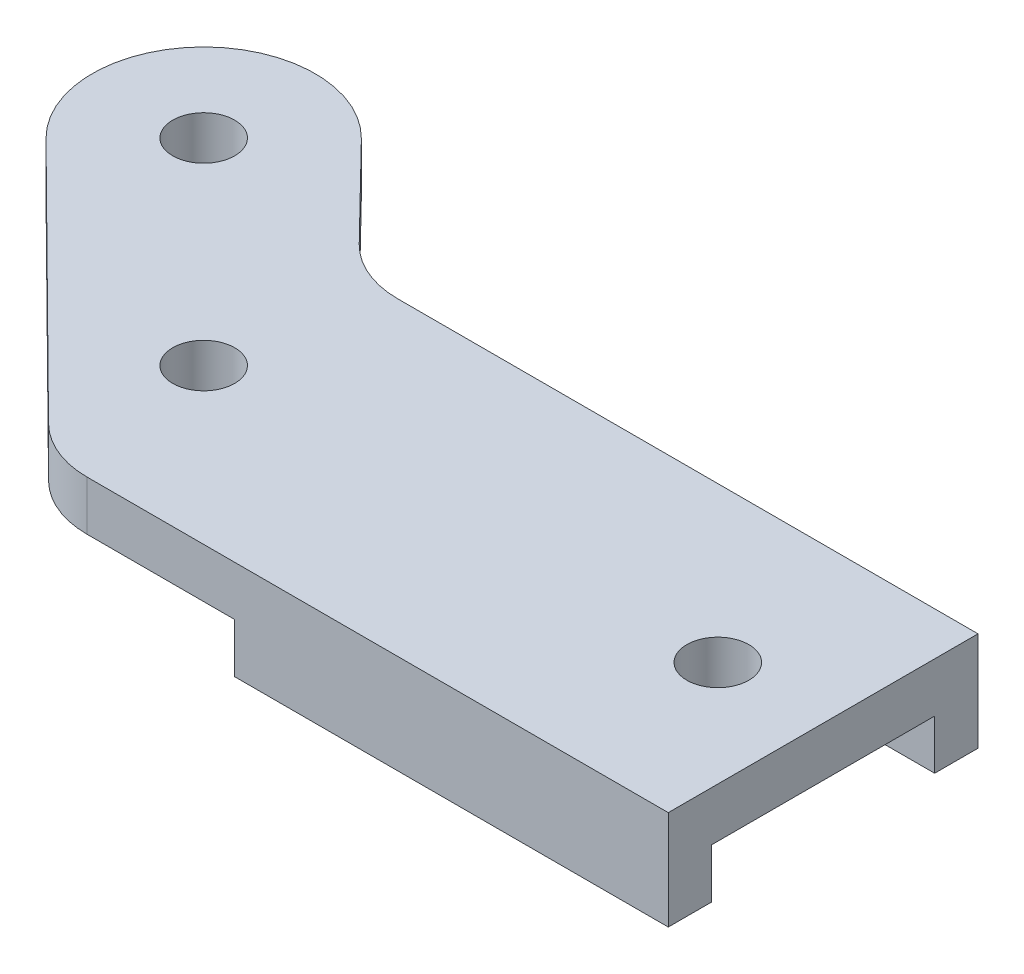
ISO-10303-21;
HEADER;
FILE_DESCRIPTION(('STEP AP214'),'2;1');
FILE_NAME('part.step','',(''),(''),'','','');
FILE_SCHEMA(('AUTOMOTIVE_DESIGN { 1 0 10303 214 1 1 1 1 }'));
ENDSEC;
DATA;
#1=APPLICATION_CONTEXT('core data for automotive mechanical design processes');
#2=APPLICATION_PROTOCOL_DEFINITION('international standard','automotive_design',2000,#1);
#3=PRODUCT_CONTEXT('',#1,'mechanical');
#4=PRODUCT('Part','Part','',(#3));
#5=PRODUCT_RELATED_PRODUCT_CATEGORY('part','',(#4));
#6=PRODUCT_DEFINITION_FORMATION('','',#4);
#7=PRODUCT_DEFINITION_CONTEXT('part definition',#1,'design');
#8=PRODUCT_DEFINITION('design','',#6,#7);
#9=PRODUCT_DEFINITION_SHAPE('','',#8);
#10=(LENGTH_UNIT() NAMED_UNIT(*) SI_UNIT(.MILLI.,.METRE.));
#11=(NAMED_UNIT(*) PLANE_ANGLE_UNIT() SI_UNIT($,.RADIAN.));
#12=(NAMED_UNIT(*) SI_UNIT($,.STERADIAN.) SOLID_ANGLE_UNIT());
#13=UNCERTAINTY_MEASURE_WITH_UNIT(LENGTH_MEASURE(1.E-05),#10,'distance_accuracy_value','');
#14=(GEOMETRIC_REPRESENTATION_CONTEXT(3) GLOBAL_UNCERTAINTY_ASSIGNED_CONTEXT((#13)) GLOBAL_UNIT_ASSIGNED_CONTEXT((#10,
#11,#12)) REPRESENTATION_CONTEXT('',''));
#15=CARTESIAN_POINT('',(0.,0.,0.));
#16=DIRECTION('',(0.,0.,1.));
#17=DIRECTION('',(1.,0.,0.));
#18=AXIS2_PLACEMENT_3D('',#15,#16,#17);
#19=CARTESIAN_POINT('',(-31.8198051533948,0.,-31.8198051533945));
#20=DIRECTION('',(0.,1.,0.));
#21=DIRECTION('',(0.,0.,1.));
#22=AXIS2_PLACEMENT_3D('',#19,#20,#21);
#23=PLANE('',#22);
#24=CARTESIAN_POINT('',(83.,0.,0.));
#25=DIRECTION('',(0.,1.,0.));
#26=DIRECTION('',(0.,0.,1.));
#27=AXIS2_PLACEMENT_3D('',#24,#25,#26);
#28=CIRCLE('',#27,5.);
#29=CARTESIAN_POINT('',(83.,0.,5.));
#30=VERTEX_POINT('',#29);
#31=EDGE_CURVE('E200',#30,#30,#28,.T.);
#32=ORIENTED_EDGE('',*,*,#31,.T.);
#33=EDGE_LOOP('',(#32));
#34=FACE_BOUND('',#33,.T.);
#35=DIRECTION('',(1.,0.,0.));
#36=VECTOR('',#35,1.);
#37=CARTESIAN_POINT('',(50.,0.,18.));
#38=LINE('',#37,#36);
#39=CARTESIAN_POINT('',(50.,0.,18.));
#40=VERTEX_POINT('',#39);
#41=CARTESIAN_POINT('',(100.,0.,18.));
#42=VERTEX_POINT('',#41);
#43=EDGE_CURVE('E160',#40,#42,#38,.T.);
#44=ORIENTED_EDGE('',*,*,#43,.F.);
#45=DIRECTION('',(0.,0.,1.));
#46=VECTOR('',#45,1.);
#47=CARTESIAN_POINT('',(50.,0.,-18.));
#48=LINE('',#47,#46);
#49=CARTESIAN_POINT('',(50.,0.,-18.));
#50=VERTEX_POINT('',#49);
#51=EDGE_CURVE('E163',#50,#40,#48,.T.);
#52=ORIENTED_EDGE('',*,*,#51,.F.);
#53=DIRECTION('',(-1.,0.,0.));
#54=VECTOR('',#53,1.);
#55=CARTESIAN_POINT('',(100.,0.,-18.));
#56=LINE('',#55,#54);
#57=CARTESIAN_POINT('',(100.,0.,-18.));
#58=VERTEX_POINT('',#57);
#59=EDGE_CURVE('E181',#58,#50,#56,.T.);
#60=ORIENTED_EDGE('',*,*,#59,.F.);
#61=DIRECTION('',(0.,0.,-1.));
#62=VECTOR('',#61,1.);
#63=CARTESIAN_POINT('',(100.,0.,-25.));
#64=LINE('',#63,#62);
#65=EDGE_CURVE('E237',#42,#58,#64,.T.);
#66=ORIENTED_EDGE('',*,*,#65,.F.);
#67=EDGE_LOOP('',(#44,#52,#60,#66));
#68=FACE_BOUND('',#67,.T.);
#69=ADVANCED_FACE('F32',(#34,#68),#23,.F.);
#70=CARTESIAN_POINT('',(0.,0.,0.));
#71=DIRECTION('',(0.,1.,0.));
#72=DIRECTION('',(0.,0.,1.));
#73=AXIS2_PLACEMENT_3D('',#70,#71,#72);
#74=CIRCLE('',#73,5.);
#75=CARTESIAN_POINT('',(0.,0.,5.));
#76=VERTEX_POINT('',#75);
#77=EDGE_CURVE('E204',#76,#76,#74,.T.);
#78=ORIENTED_EDGE('',*,*,#77,.T.);
#79=EDGE_LOOP('',(#78));
#80=FACE_BOUND('',#79,.T.);
#81=CARTESIAN_POINT('',(-31.8198051533948,0.,-31.8198051533945));
#82=DIRECTION('',(0.,1.,0.));
#83=DIRECTION('',(0.,0.,1.));
#84=AXIS2_PLACEMENT_3D('',#81,#82,#83);
#85=CIRCLE('',#84,5.);
#86=CARTESIAN_POINT('',(-31.8198051533948,0.,-26.8198051533945));
#87=VERTEX_POINT('',#86);
#88=EDGE_CURVE('E210',#87,#87,#85,.T.);
#89=ORIENTED_EDGE('',*,*,#88,.T.);
#90=EDGE_LOOP('',(#89));
#91=FACE_BOUND('',#90,.T.);
#92=DIRECTION('',(1.,0.,0.));
#93=VECTOR('',#92,1.);
#94=CARTESIAN_POINT('',(0.,0.,25.));
#95=LINE('',#94,#93);
#96=CARTESIAN_POINT('',(6.16803088402929,0.,25.));
#97=VERTEX_POINT('',#96);
#98=CARTESIAN_POINT('',(30.,0.,25.));
#99=VERTEX_POINT('',#98);
#100=EDGE_CURVE('E235',#97,#99,#95,.T.);
#101=ORIENTED_EDGE('',*,*,#100,.F.);
#102=CARTESIAN_POINT('',(6.16803088402929,0.,10.));
#103=DIRECTION('',(0.,1.,0.));
#104=DIRECTION('',(0.,0.,1.));
#105=AXIS2_PLACEMENT_3D('',#102,#103,#104);
#106=CIRCLE('',#105,15.);
#107=CARTESIAN_POINT('',(-4.38384452112235,0.,20.6610471077731));
#108=VERTEX_POINT('',#107);
#109=EDGE_CURVE('E253',#97,#108,#106,.F.);
#110=ORIENTED_EDGE('',*,*,#109,.T.);
#111=DIRECTION('',(0.710736473851536,0.,0.703458360343442));
#112=VECTOR('',#111,1.);
#113=CARTESIAN_POINT('',(0.,0.,25.));
#114=LINE('',#113,#112);
#115=CARTESIAN_POINT('',(-44.4820556395768,0.,-19.0265486240668));
#116=VERTEX_POINT('',#115);
#117=EDGE_CURVE('E216',#116,#108,#114,.T.);
#118=ORIENTED_EDGE('',*,*,#117,.F.);
#119=CARTESIAN_POINT('',(-31.8198051533948,0.,-31.8198051533945));
#120=DIRECTION('',(0.,1.,0.));
#121=DIRECTION('',(0.,0.,1.));
#122=AXIS2_PLACEMENT_3D('',#119,#120,#121);
#123=CIRCLE('',#122,18.);
#124=CARTESIAN_POINT('',(-18.9420427064823,0.,-44.3961016814225));
#125=VERTEX_POINT('',#124);
#126=EDGE_CURVE('E223',#125,#116,#123,.T.);
#127=ORIENTED_EDGE('',*,*,#126,.F.);
#128=DIRECTION('',(-0.698683140446,0.,-0.715431247050697));
#129=VECTOR('',#128,1.);
#130=CARTESIAN_POINT('',(0.,0.,-25.));
#131=LINE('',#130,#129);
#132=CARTESIAN_POINT('',(-4.41394635551046,0.,-29.51975289331));
#133=VERTEX_POINT('',#132);
#134=EDGE_CURVE('E242',#133,#125,#131,.T.);
#135=ORIENTED_EDGE('',*,*,#134,.F.);
#136=CARTESIAN_POINT('',(6.31752235025,0.,-40.));
#137=DIRECTION('',(0.,1.,0.));
#138=DIRECTION('',(0.,0.,1.));
#139=AXIS2_PLACEMENT_3D('',#136,#137,#138);
#140=CIRCLE('',#139,15.);
#141=CARTESIAN_POINT('',(6.31752235025,0.,-25.));
#142=VERTEX_POINT('',#141);
#143=EDGE_CURVE('E40',#133,#142,#140,.T.);
#144=ORIENTED_EDGE('',*,*,#143,.T.);
#145=DIRECTION('',(-1.,0.,0.));
#146=VECTOR('',#145,1.);
#147=CARTESIAN_POINT('',(0.,0.,-25.));
#148=LINE('',#147,#146);
#149=CARTESIAN_POINT('',(30.,0.,-25.));
#150=VERTEX_POINT('',#149);
#151=EDGE_CURVE('E240',#150,#142,#148,.T.);
#152=ORIENTED_EDGE('',*,*,#151,.F.);
#153=DIRECTION('',(0.,0.,-1.));
#154=VECTOR('',#153,1.);
#155=CARTESIAN_POINT('',(30.,0.,25.));
#156=LINE('',#155,#154);
#157=EDGE_CURVE('E178',#99,#150,#156,.T.);
#158=ORIENTED_EDGE('',*,*,#157,.F.);
#159=EDGE_LOOP('',(#101,#110,#118,#127,#135,#144,#152,#158));
#160=FACE_BOUND('',#159,.T.);
#161=ADVANCED_FACE('F265',(#80,#91,#160),#23,.F.);
#162=CARTESIAN_POINT('',(-31.8198051533948,8.,-31.8198051533945));
#163=DIRECTION('',(0.,1.,0.));
#164=DIRECTION('',(0.,0.,1.));
#165=AXIS2_PLACEMENT_3D('',#162,#163,#164);
#166=PLANE('',#165);
#167=CARTESIAN_POINT('',(0.,8.,0.));
#168=DIRECTION('',(0.,1.,0.));
#169=DIRECTION('',(0.,0.,1.));
#170=AXIS2_PLACEMENT_3D('',#167,#168,#169);
#171=CIRCLE('',#170,5.);
#172=CARTESIAN_POINT('',(0.,8.,5.));
#173=VERTEX_POINT('',#172);
#174=EDGE_CURVE('E207',#173,#173,#171,.T.);
#175=ORIENTED_EDGE('',*,*,#174,.F.);
#176=EDGE_LOOP('',(#175));
#177=FACE_BOUND('',#176,.T.);
#178=DIRECTION('',(0.710736473851536,0.,0.703458360343442));
#179=VECTOR('',#178,1.);
#180=CARTESIAN_POINT('',(0.,8.,25.));
#181=LINE('',#180,#179);
#182=CARTESIAN_POINT('',(-44.4820556395768,8.,-19.0265486240668));
#183=VERTEX_POINT('',#182);
#184=CARTESIAN_POINT('',(-4.38384452112235,8.,20.6610471077731));
#185=VERTEX_POINT('',#184);
#186=EDGE_CURVE('E219',#183,#185,#181,.T.);
#187=ORIENTED_EDGE('',*,*,#186,.T.);
#188=CARTESIAN_POINT('',(6.16803088402929,8.,10.));
#189=DIRECTION('',(0.,1.,0.));
#190=DIRECTION('',(0.,0.,1.));
#191=AXIS2_PLACEMENT_3D('',#188,#189,#190);
#192=CIRCLE('',#191,15.);
#193=CARTESIAN_POINT('',(6.16803088402929,8.,25.));
#194=VERTEX_POINT('',#193);
#195=EDGE_CURVE('E257',#185,#194,#192,.T.);
#196=ORIENTED_EDGE('',*,*,#195,.T.);
#197=DIRECTION('',(1.,0.,0.));
#198=VECTOR('',#197,1.);
#199=CARTESIAN_POINT('',(0.,8.,25.));
#200=LINE('',#199,#198);
#201=CARTESIAN_POINT('',(100.,8.,25.));
#202=VERTEX_POINT('',#201);
#203=EDGE_CURVE('E222',#194,#202,#200,.T.);
#204=ORIENTED_EDGE('',*,*,#203,.T.);
#205=DIRECTION('',(0.,0.,-1.));
#206=VECTOR('',#205,1.);
#207=CARTESIAN_POINT('',(100.,8.,-25.));
#208=LINE('',#207,#206);
#209=CARTESIAN_POINT('',(100.,8.,-25.));
#210=VERTEX_POINT('',#209);
#211=EDGE_CURVE('E141',#202,#210,#208,.T.);
#212=ORIENTED_EDGE('',*,*,#211,.T.);
#213=DIRECTION('',(-1.,0.,0.));
#214=VECTOR('',#213,1.);
#215=CARTESIAN_POINT('',(0.,8.,-25.));
#216=LINE('',#215,#214);
#217=CARTESIAN_POINT('',(6.31752235025,8.,-25.));
#218=VERTEX_POINT('',#217);
#219=EDGE_CURVE('E226',#210,#218,#216,.T.);
#220=ORIENTED_EDGE('',*,*,#219,.T.);
#221=CARTESIAN_POINT('',(6.31752235025,8.,-40.));
#222=DIRECTION('',(0.,1.,0.));
#223=DIRECTION('',(0.,0.,1.));
#224=AXIS2_PLACEMENT_3D('',#221,#222,#223);
#225=CIRCLE('',#224,15.);
#226=CARTESIAN_POINT('',(-4.41394635551046,8.,-29.51975289331));
#227=VERTEX_POINT('',#226);
#228=EDGE_CURVE('E11',#218,#227,#225,.F.);
#229=ORIENTED_EDGE('',*,*,#228,.T.);
#230=DIRECTION('',(-0.698683140446,0.,-0.715431247050697));
#231=VECTOR('',#230,1.);
#232=CARTESIAN_POINT('',(0.,8.,-25.));
#233=LINE('',#232,#231);
#234=CARTESIAN_POINT('',(-18.9420427064823,8.,-44.3961016814225));
#235=VERTEX_POINT('',#234);
#236=EDGE_CURVE('E228',#227,#235,#233,.T.);
#237=ORIENTED_EDGE('',*,*,#236,.T.);
#238=CARTESIAN_POINT('',(-31.8198051533948,8.,-31.8198051533945));
#239=DIRECTION('',(0.,1.,0.));
#240=DIRECTION('',(0.,0.,1.));
#241=AXIS2_PLACEMENT_3D('',#238,#239,#240);
#242=CIRCLE('',#241,18.);
#243=EDGE_CURVE('E230',#235,#183,#242,.T.);
#244=ORIENTED_EDGE('',*,*,#243,.T.);
#245=EDGE_LOOP('',(#187,#196,#204,#212,#220,#229,#237,#244));
#246=FACE_BOUND('',#245,.T.);
#247=CARTESIAN_POINT('',(-31.8198051533948,8.,-31.8198051533945));
#248=DIRECTION('',(0.,1.,0.));
#249=DIRECTION('',(0.,0.,1.));
#250=AXIS2_PLACEMENT_3D('',#247,#248,#249);
#251=CIRCLE('',#250,5.);
#252=CARTESIAN_POINT('',(-31.8198051533948,8.,-26.8198051533945));
#253=VERTEX_POINT('',#252);
#254=EDGE_CURVE('E213',#253,#253,#251,.T.);
#255=ORIENTED_EDGE('',*,*,#254,.F.);
#256=EDGE_LOOP('',(#255));
#257=FACE_BOUND('',#256,.T.);
#258=CARTESIAN_POINT('',(83.,8.,0.));
#259=DIRECTION('',(0.,1.,0.));
#260=DIRECTION('',(0.,0.,1.));
#261=AXIS2_PLACEMENT_3D('',#258,#259,#260);
#262=CIRCLE('',#261,5.);
#263=CARTESIAN_POINT('',(83.,8.,5.));
#264=VERTEX_POINT('',#263);
#265=EDGE_CURVE('E201',#264,#264,#262,.T.);
#266=ORIENTED_EDGE('',*,*,#265,.F.);
#267=EDGE_LOOP('',(#266));
#268=FACE_BOUND('',#267,.T.);
#269=ADVANCED_FACE('F277',(#177,#246,#257,#268),#166,.T.);
#270=CARTESIAN_POINT('',(0.,8.,25.));
#271=DIRECTION('',(0.703458360343442,0.,-0.710736473851536));
#272=DIRECTION('',(-0.710736473851536,0.,-0.703458360343442));
#273=AXIS2_PLACEMENT_3D('',#270,#271,#272);
#274=PLANE('',#273);
#275=ORIENTED_EDGE('',*,*,#117,.T.);
#276=DIRECTION('',(0.,-1.,0.));
#277=VECTOR('',#276,1.);
#278=CARTESIAN_POINT('',(-4.38384452112235,8.,20.6610471077731));
#279=LINE('',#278,#277);
#280=EDGE_CURVE('E255',#108,#185,#279,.F.);
#281=ORIENTED_EDGE('',*,*,#280,.T.);
#282=ORIENTED_EDGE('',*,*,#186,.F.);
#283=DIRECTION('',(0.,-1.,0.));
#284=VECTOR('',#283,1.);
#285=CARTESIAN_POINT('',(-44.4820556395768,8.,-19.0265486240668));
#286=LINE('',#285,#284);
#287=EDGE_CURVE('E232',#183,#116,#286,.T.);
#288=ORIENTED_EDGE('',*,*,#287,.T.);
#289=EDGE_LOOP('',(#275,#281,#282,#288));
#290=FACE_BOUND('',#289,.T.);
#291=ADVANCED_FACE('F286',(#290),#274,.F.);
#292=CARTESIAN_POINT('',(0.,8.,25.));
#293=DIRECTION('',(0.,0.,-1.));
#294=DIRECTION('',(-1.,0.,0.));
#295=AXIS2_PLACEMENT_3D('',#292,#293,#294);
#296=PLANE('',#295);
#297=ORIENTED_EDGE('',*,*,#203,.F.);
#298=DIRECTION('',(0.,-1.,0.));
#299=VECTOR('',#298,1.);
#300=CARTESIAN_POINT('',(6.16803088402929,8.,25.));
#301=LINE('',#300,#299);
#302=EDGE_CURVE('E144',#194,#97,#301,.T.);
#303=ORIENTED_EDGE('',*,*,#302,.T.);
#304=ORIENTED_EDGE('',*,*,#100,.T.);
#305=DIRECTION('',(0.,1.,0.));
#306=VECTOR('',#305,1.);
#307=CARTESIAN_POINT('',(30.,-8.,25.));
#308=LINE('',#307,#306);
#309=CARTESIAN_POINT('',(30.,-8.,25.));
#310=VERTEX_POINT('',#309);
#311=EDGE_CURVE('E151',#310,#99,#308,.T.);
#312=ORIENTED_EDGE('',*,*,#311,.F.);
#313=DIRECTION('',(-1.,0.,0.));
#314=VECTOR('',#313,1.);
#315=CARTESIAN_POINT('',(100.,-8.,25.));
#316=LINE('',#315,#314);
#317=CARTESIAN_POINT('',(100.,-8.,25.));
#318=VERTEX_POINT('',#317);
#319=EDGE_CURVE('E148',#318,#310,#316,.T.);
#320=ORIENTED_EDGE('',*,*,#319,.F.);
#321=DIRECTION('',(0.,-1.,0.));
#322=VECTOR('',#321,1.);
#323=CARTESIAN_POINT('',(100.,8.,25.));
#324=LINE('',#323,#322);
#325=EDGE_CURVE('E134',#202,#318,#324,.T.);
#326=ORIENTED_EDGE('',*,*,#325,.F.);
#327=EDGE_LOOP('',(#297,#303,#304,#312,#320,#326));
#328=FACE_BOUND('',#327,.T.);
#329=ADVANCED_FACE('F149',(#328),#296,.F.);
#330=CARTESIAN_POINT('',(100.,8.,-25.));
#331=DIRECTION('',(-1.,0.,0.));
#332=DIRECTION('',(0.,0.,1.));
#333=AXIS2_PLACEMENT_3D('',#330,#331,#332);
#334=PLANE('',#333);
#335=ORIENTED_EDGE('',*,*,#325,.T.);
#336=DIRECTION('',(0.,0.,1.));
#337=VECTOR('',#336,1.);
#338=CARTESIAN_POINT('',(100.,-8.,18.));
#339=LINE('',#338,#337);
#340=CARTESIAN_POINT('',(100.,-8.,18.));
#341=VERTEX_POINT('',#340);
#342=EDGE_CURVE('E139',#341,#318,#339,.T.);
#343=ORIENTED_EDGE('',*,*,#342,.F.);
#344=DIRECTION('',(0.,1.,0.));
#345=VECTOR('',#344,1.);
#346=CARTESIAN_POINT('',(100.,-8.,18.));
#347=LINE('',#346,#345);
#348=EDGE_CURVE('E177',#341,#42,#347,.T.);
#349=ORIENTED_EDGE('',*,*,#348,.T.);
#350=ORIENTED_EDGE('',*,*,#65,.T.);
#351=DIRECTION('',(0.,1.,0.));
#352=VECTOR('',#351,1.);
#353=CARTESIAN_POINT('',(100.,-8.,-18.));
#354=LINE('',#353,#352);
#355=CARTESIAN_POINT('',(100.,-8.,-18.));
#356=VERTEX_POINT('',#355);
#357=EDGE_CURVE('E193',#356,#58,#354,.T.);
#358=ORIENTED_EDGE('',*,*,#357,.F.);
#359=DIRECTION('',(0.,0.,1.));
#360=VECTOR('',#359,1.);
#361=CARTESIAN_POINT('',(100.,-8.,-25.));
#362=LINE('',#361,#360);
#363=CARTESIAN_POINT('',(100.,-8.,-25.));
#364=VERTEX_POINT('',#363);
#365=EDGE_CURVE('E170',#364,#356,#362,.T.);
#366=ORIENTED_EDGE('',*,*,#365,.F.);
#367=DIRECTION('',(0.,-1.,0.));
#368=VECTOR('',#367,1.);
#369=CARTESIAN_POINT('',(100.,8.,-25.));
#370=LINE('',#369,#368);
#371=EDGE_CURVE('E145',#210,#364,#370,.T.);
#372=ORIENTED_EDGE('',*,*,#371,.F.);
#373=ORIENTED_EDGE('',*,*,#211,.F.);
#374=EDGE_LOOP('',(#335,#343,#349,#350,#358,#366,#372,#373));
#375=FACE_BOUND('',#374,.T.);
#376=ADVANCED_FACE('F136',(#375),#334,.F.);
#377=CARTESIAN_POINT('',(0.,8.,-25.));
#378=DIRECTION('',(0.,0.,1.));
#379=DIRECTION('',(1.,0.,0.));
#380=AXIS2_PLACEMENT_3D('',#377,#378,#379);
#381=PLANE('',#380);
#382=ORIENTED_EDGE('',*,*,#151,.T.);
#383=DIRECTION('',(0.,-1.,0.));
#384=VECTOR('',#383,1.);
#385=CARTESIAN_POINT('',(6.31752235025,8.,-25.));
#386=LINE('',#385,#384);
#387=EDGE_CURVE('E53',#142,#218,#386,.F.);
#388=ORIENTED_EDGE('',*,*,#387,.T.);
#389=ORIENTED_EDGE('',*,*,#219,.F.);
#390=ORIENTED_EDGE('',*,*,#371,.T.);
#391=DIRECTION('',(1.,0.,0.));
#392=VECTOR('',#391,1.);
#393=CARTESIAN_POINT('',(30.,-8.,-25.));
#394=LINE('',#393,#392);
#395=CARTESIAN_POINT('',(30.,-8.,-25.));
#396=VERTEX_POINT('',#395);
#397=EDGE_CURVE('E167',#396,#364,#394,.T.);
#398=ORIENTED_EDGE('',*,*,#397,.F.);
#399=DIRECTION('',(0.,1.,0.));
#400=VECTOR('',#399,1.);
#401=CARTESIAN_POINT('',(30.,-8.,-25.));
#402=LINE('',#401,#400);
#403=EDGE_CURVE('E196',#396,#150,#402,.T.);
#404=ORIENTED_EDGE('',*,*,#403,.T.);
#405=EDGE_LOOP('',(#382,#388,#389,#390,#398,#404));
#406=FACE_BOUND('',#405,.T.);
#407=ADVANCED_FACE('F270',(#406),#381,.F.);
#408=CARTESIAN_POINT('',(0.,8.,-25.));
#409=DIRECTION('',(-0.715431247050697,0.,0.698683140446));
#410=DIRECTION('',(0.698683140446,0.,0.715431247050697));
#411=AXIS2_PLACEMENT_3D('',#408,#409,#410);
#412=PLANE('',#411);
#413=ORIENTED_EDGE('',*,*,#236,.F.);
#414=DIRECTION('',(0.,-1.,0.));
#415=VECTOR('',#414,1.);
#416=CARTESIAN_POINT('',(-4.41394635551046,0.,-29.51975289331));
#417=LINE('',#416,#415);
#418=EDGE_CURVE('E259',#227,#133,#417,.T.);
#419=ORIENTED_EDGE('',*,*,#418,.T.);
#420=ORIENTED_EDGE('',*,*,#134,.T.);
#421=DIRECTION('',(0.,-1.,0.));
#422=VECTOR('',#421,1.);
#423=CARTESIAN_POINT('',(-18.9420427064823,8.,-44.3961016814225));
#424=LINE('',#423,#422);
#425=EDGE_CURVE('E247',#235,#125,#424,.T.);
#426=ORIENTED_EDGE('',*,*,#425,.F.);
#427=EDGE_LOOP('',(#413,#419,#420,#426));
#428=FACE_BOUND('',#427,.T.);
#429=ADVANCED_FACE('F274',(#428),#412,.F.);
#430=CARTESIAN_POINT('',(-31.8198051533948,8.,-31.8198051533945));
#431=DIRECTION('',(0.,-1.,0.));
#432=DIRECTION('',(0.,0.,-1.));
#433=AXIS2_PLACEMENT_3D('',#430,#431,#432);
#434=CYLINDRICAL_SURFACE('',#433,18.);
#435=ORIENTED_EDGE('',*,*,#126,.T.);
#436=ORIENTED_EDGE('',*,*,#287,.F.);
#437=ORIENTED_EDGE('',*,*,#243,.F.);
#438=ORIENTED_EDGE('',*,*,#425,.T.);
#439=EDGE_LOOP('',(#435,#436,#437,#438));
#440=FACE_BOUND('',#439,.T.);
#441=ADVANCED_FACE('F283',(#440),#434,.T.);
#442=CARTESIAN_POINT('',(-31.8198051533948,8.,-31.8198051533945));
#443=DIRECTION('',(0.,-1.,0.));
#444=DIRECTION('',(0.,0.,-1.));
#445=AXIS2_PLACEMENT_3D('',#442,#443,#444);
#446=CYLINDRICAL_SURFACE('',#445,5.);
#447=ORIENTED_EDGE('',*,*,#254,.T.);
#448=EDGE_LOOP('',(#447));
#449=FACE_BOUND('',#448,.T.);
#450=ORIENTED_EDGE('',*,*,#88,.F.);
#451=EDGE_LOOP('',(#450));
#452=FACE_BOUND('',#451,.T.);
#453=ADVANCED_FACE('F318',(#449,#452),#446,.F.);
#454=CARTESIAN_POINT('',(0.,8.,0.));
#455=DIRECTION('',(0.,-1.,0.));
#456=DIRECTION('',(0.,0.,-1.));
#457=AXIS2_PLACEMENT_3D('',#454,#455,#456);
#458=CYLINDRICAL_SURFACE('',#457,5.);
#459=ORIENTED_EDGE('',*,*,#174,.T.);
#460=EDGE_LOOP('',(#459));
#461=FACE_BOUND('',#460,.T.);
#462=ORIENTED_EDGE('',*,*,#77,.F.);
#463=EDGE_LOOP('',(#462));
#464=FACE_BOUND('',#463,.T.);
#465=ADVANCED_FACE('F348',(#461,#464),#458,.F.);
#466=CARTESIAN_POINT('',(83.,8.,0.));
#467=DIRECTION('',(0.,-1.,0.));
#468=DIRECTION('',(0.,0.,-1.));
#469=AXIS2_PLACEMENT_3D('',#466,#467,#468);
#470=CYLINDRICAL_SURFACE('',#469,5.);
#471=ORIENTED_EDGE('',*,*,#265,.T.);
#472=EDGE_LOOP('',(#471));
#473=FACE_BOUND('',#472,.T.);
#474=ORIENTED_EDGE('',*,*,#31,.F.);
#475=EDGE_LOOP('',(#474));
#476=FACE_BOUND('',#475,.T.);
#477=ADVANCED_FACE('F345',(#473,#476),#470,.F.);
#478=CARTESIAN_POINT('',(30.,-8.,25.));
#479=DIRECTION('',(1.,0.,0.));
#480=DIRECTION('',(0.,0.,-1.));
#481=AXIS2_PLACEMENT_3D('',#478,#479,#480);
#482=PLANE('',#481);
#483=ORIENTED_EDGE('',*,*,#157,.T.);
#484=ORIENTED_EDGE('',*,*,#403,.F.);
#485=DIRECTION('',(0.,0.,-1.));
#486=VECTOR('',#485,1.);
#487=CARTESIAN_POINT('',(30.,-8.,25.));
#488=LINE('',#487,#486);
#489=EDGE_CURVE('E154',#310,#396,#488,.T.);
#490=ORIENTED_EDGE('',*,*,#489,.F.);
#491=ORIENTED_EDGE('',*,*,#311,.T.);
#492=EDGE_LOOP('',(#483,#484,#490,#491));
#493=FACE_BOUND('',#492,.T.);
#494=ADVANCED_FACE('F292',(#493),#482,.F.);
#495=CARTESIAN_POINT('',(100.,-8.,-18.));
#496=DIRECTION('',(0.,0.,-1.));
#497=DIRECTION('',(-1.,0.,0.));
#498=AXIS2_PLACEMENT_3D('',#495,#496,#497);
#499=PLANE('',#498);
#500=ORIENTED_EDGE('',*,*,#59,.T.);
#501=DIRECTION('',(0.,1.,0.));
#502=VECTOR('',#501,1.);
#503=CARTESIAN_POINT('',(50.,-8.,-18.));
#504=LINE('',#503,#502);
#505=CARTESIAN_POINT('',(50.,-8.,-18.));
#506=VERTEX_POINT('',#505);
#507=EDGE_CURVE('E190',#506,#50,#504,.T.);
#508=ORIENTED_EDGE('',*,*,#507,.F.);
#509=DIRECTION('',(-1.,0.,0.));
#510=VECTOR('',#509,1.);
#511=CARTESIAN_POINT('',(100.,-8.,-18.));
#512=LINE('',#511,#510);
#513=EDGE_CURVE('E172',#356,#506,#512,.T.);
#514=ORIENTED_EDGE('',*,*,#513,.F.);
#515=ORIENTED_EDGE('',*,*,#357,.T.);
#516=EDGE_LOOP('',(#500,#508,#514,#515));
#517=FACE_BOUND('',#516,.T.);
#518=ADVANCED_FACE('F298',(#517),#499,.F.);
#519=CARTESIAN_POINT('',(50.,-8.,-18.));
#520=DIRECTION('',(-1.,0.,0.));
#521=DIRECTION('',(0.,0.,1.));
#522=AXIS2_PLACEMENT_3D('',#519,#520,#521);
#523=PLANE('',#522);
#524=ORIENTED_EDGE('',*,*,#51,.T.);
#525=DIRECTION('',(0.,1.,0.));
#526=VECTOR('',#525,1.);
#527=CARTESIAN_POINT('',(50.,-8.,18.));
#528=LINE('',#527,#526);
#529=CARTESIAN_POINT('',(50.,-8.,18.));
#530=VERTEX_POINT('',#529);
#531=EDGE_CURVE('E187',#530,#40,#528,.T.);
#532=ORIENTED_EDGE('',*,*,#531,.F.);
#533=DIRECTION('',(0.,0.,1.));
#534=VECTOR('',#533,1.);
#535=CARTESIAN_POINT('',(50.,-8.,-18.));
#536=LINE('',#535,#534);
#537=EDGE_CURVE('E174',#506,#530,#536,.T.);
#538=ORIENTED_EDGE('',*,*,#537,.F.);
#539=ORIENTED_EDGE('',*,*,#507,.T.);
#540=EDGE_LOOP('',(#524,#532,#538,#539));
#541=FACE_BOUND('',#540,.T.);
#542=ADVANCED_FACE('F302',(#541),#523,.F.);
#543=CARTESIAN_POINT('',(50.,-8.,18.));
#544=DIRECTION('',(0.,0.,1.));
#545=DIRECTION('',(1.,0.,0.));
#546=AXIS2_PLACEMENT_3D('',#543,#544,#545);
#547=PLANE('',#546);
#548=ORIENTED_EDGE('',*,*,#43,.T.);
#549=ORIENTED_EDGE('',*,*,#348,.F.);
#550=DIRECTION('',(1.,0.,0.));
#551=VECTOR('',#550,1.);
#552=CARTESIAN_POINT('',(50.,-8.,18.));
#553=LINE('',#552,#551);
#554=EDGE_CURVE('E158',#530,#341,#553,.T.);
#555=ORIENTED_EDGE('',*,*,#554,.F.);
#556=ORIENTED_EDGE('',*,*,#531,.T.);
#557=EDGE_LOOP('',(#548,#549,#555,#556));
#558=FACE_BOUND('',#557,.T.);
#559=ADVANCED_FACE('F304',(#558),#547,.F.);
#560=CARTESIAN_POINT('',(0.,-8.,0.));
#561=DIRECTION('',(0.,-1.,0.));
#562=DIRECTION('',(0.,0.,-1.));
#563=AXIS2_PLACEMENT_3D('',#560,#561,#562);
#564=PLANE('',#563);
#565=ORIENTED_EDGE('',*,*,#342,.T.);
#566=ORIENTED_EDGE('',*,*,#319,.T.);
#567=ORIENTED_EDGE('',*,*,#489,.T.);
#568=ORIENTED_EDGE('',*,*,#397,.T.);
#569=ORIENTED_EDGE('',*,*,#365,.T.);
#570=ORIENTED_EDGE('',*,*,#513,.T.);
#571=ORIENTED_EDGE('',*,*,#537,.T.);
#572=ORIENTED_EDGE('',*,*,#554,.T.);
#573=EDGE_LOOP('',(#565,#566,#567,#568,#569,#570,#571,#572));
#574=FACE_BOUND('',#573,.T.);
#575=ADVANCED_FACE('F156',(#574),#564,.T.);
#576=CARTESIAN_POINT('',(6.16803088402929,8.,10.));
#577=DIRECTION('',(0.,-1.,0.));
#578=DIRECTION('',(0.,0.,-1.));
#579=AXIS2_PLACEMENT_3D('',#576,#577,#578);
#580=CYLINDRICAL_SURFACE('',#579,15.);
#581=ORIENTED_EDGE('',*,*,#195,.F.);
#582=ORIENTED_EDGE('',*,*,#280,.F.);
#583=ORIENTED_EDGE('',*,*,#109,.F.);
#584=ORIENTED_EDGE('',*,*,#302,.F.);
#585=EDGE_LOOP('',(#581,#582,#583,#584));
#586=FACE_BOUND('',#585,.T.);
#587=ADVANCED_FACE('F289',(#586),#580,.T.);
#588=CARTESIAN_POINT('',(6.31752235025,8.,-40.));
#589=DIRECTION('',(0.,1.,0.));
#590=DIRECTION('',(0.,0.,1.));
#591=AXIS2_PLACEMENT_3D('',#588,#589,#590);
#592=CYLINDRICAL_SURFACE('',#591,15.);
#593=ORIENTED_EDGE('',*,*,#228,.F.);
#594=ORIENTED_EDGE('',*,*,#387,.F.);
#595=ORIENTED_EDGE('',*,*,#143,.F.);
#596=ORIENTED_EDGE('',*,*,#418,.F.);
#597=EDGE_LOOP('',(#593,#594,#595,#596));
#598=FACE_BOUND('',#597,.T.);
#599=ADVANCED_FACE('F34',(#598),#592,.F.);
#600=CLOSED_SHELL('',(#69,#161,#269,#291,#329,#376,#407,#429,#441,#453,#465,#477,#494,#518,#542,
#559,#575,#587,#599));
#601=MANIFOLD_SOLID_BREP('B2',#600);
#602=ADVANCED_BREP_SHAPE_REPRESENTATION('',(#18,#601),#14);
#603=SHAPE_DEFINITION_REPRESENTATION(#9,#602);
ENDSEC;
END-ISO-10303-21;
